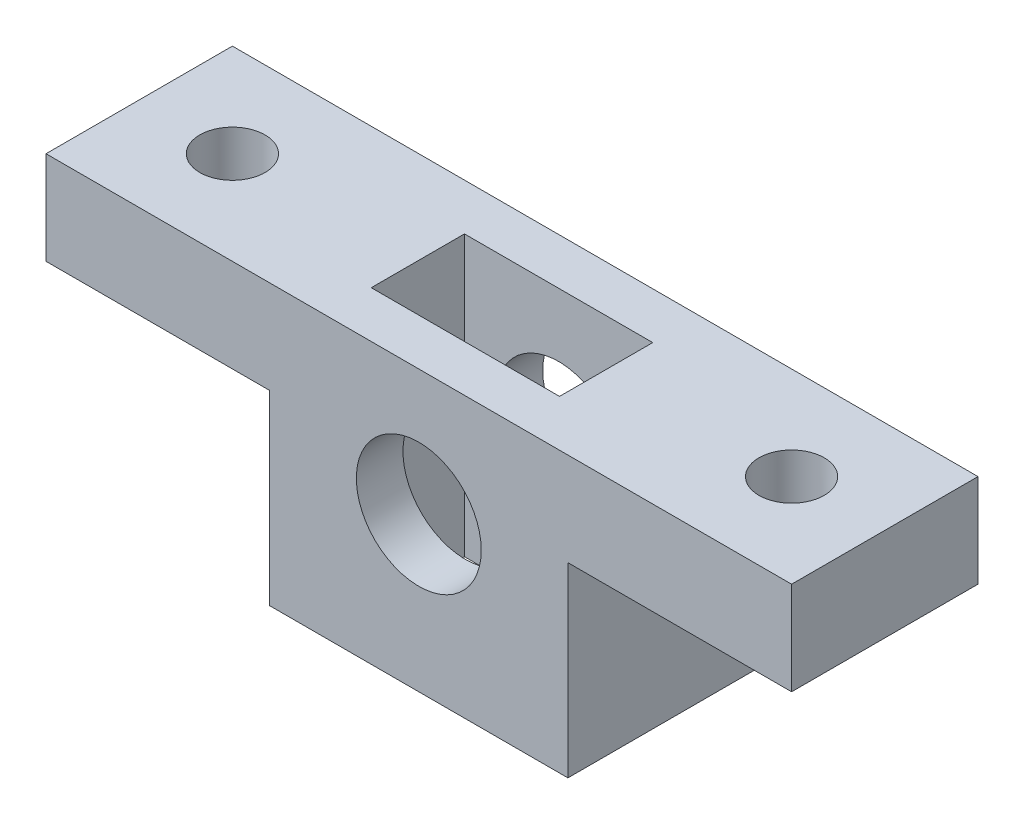
ISO-10303-21;
HEADER;
FILE_DESCRIPTION(('STEP AP214'),'2;1');
FILE_NAME('part.step','',(''),(''),'','','');
FILE_SCHEMA(('AUTOMOTIVE_DESIGN { 1 0 10303 214 1 1 1 1 }'));
ENDSEC;
DATA;
#1=APPLICATION_CONTEXT('core data for automotive mechanical design processes');
#2=APPLICATION_PROTOCOL_DEFINITION('international standard','automotive_design',2000,#1);
#3=PRODUCT_CONTEXT('',#1,'mechanical');
#4=PRODUCT('Part','Part','',(#3));
#5=PRODUCT_RELATED_PRODUCT_CATEGORY('part','',(#4));
#6=PRODUCT_DEFINITION_FORMATION('','',#4);
#7=PRODUCT_DEFINITION_CONTEXT('part definition',#1,'design');
#8=PRODUCT_DEFINITION('design','',#6,#7);
#9=PRODUCT_DEFINITION_SHAPE('','',#8);
#10=(LENGTH_UNIT() NAMED_UNIT(*) SI_UNIT(.MILLI.,.METRE.));
#11=(NAMED_UNIT(*) PLANE_ANGLE_UNIT() SI_UNIT($,.RADIAN.));
#12=(NAMED_UNIT(*) SI_UNIT($,.STERADIAN.) SOLID_ANGLE_UNIT());
#13=UNCERTAINTY_MEASURE_WITH_UNIT(LENGTH_MEASURE(1.E-05),#10,'distance_accuracy_value','');
#14=(GEOMETRIC_REPRESENTATION_CONTEXT(3) GLOBAL_UNCERTAINTY_ASSIGNED_CONTEXT((#13)) GLOBAL_UNIT_ASSIGNED_CONTEXT((#10,
#11,#12)) REPRESENTATION_CONTEXT('',''));
#15=CARTESIAN_POINT('',(0.,0.,0.));
#16=DIRECTION('',(0.,0.,1.));
#17=DIRECTION('',(1.,0.,0.));
#18=AXIS2_PLACEMENT_3D('',#15,#16,#17);
#19=CARTESIAN_POINT('',(0.,-6.74999999999999,10.));
#20=DIRECTION('',(0.,0.,-1.));
#21=DIRECTION('',(-1.,0.,0.));
#22=AXIS2_PLACEMENT_3D('',#19,#20,#21);
#23=CYLINDRICAL_SURFACE('',#22,3.35);
#24=CARTESIAN_POINT('',(0.,-6.74999999999999,2.5));
#25=DIRECTION('',(0.,0.,-1.));
#26=DIRECTION('',(-1.,0.,0.));
#27=AXIS2_PLACEMENT_3D('',#24,#25,#26);
#28=CIRCLE('',#27,3.35);
#29=CARTESIAN_POINT('',(-3.35,-6.74999999999999,2.5));
#30=VERTEX_POINT('',#29);
#31=EDGE_CURVE('E36',#30,#30,#28,.T.);
#32=ORIENTED_EDGE('',*,*,#31,.F.);
#33=EDGE_LOOP('',(#32));
#34=FACE_BOUND('',#33,.T.);
#35=CARTESIAN_POINT('',(0.,-6.74999999999999,0.));
#36=DIRECTION('',(0.,0.,1.));
#37=DIRECTION('',(1.,0.,0.));
#38=AXIS2_PLACEMENT_3D('',#35,#36,#37);
#39=CIRCLE('',#38,3.35);
#40=CARTESIAN_POINT('',(3.35,-6.74999999999999,0.));
#41=VERTEX_POINT('',#40);
#42=EDGE_CURVE('E175',#41,#41,#39,.T.);
#43=ORIENTED_EDGE('',*,*,#42,.F.);
#44=EDGE_LOOP('',(#43));
#45=FACE_BOUND('',#44,.T.);
#46=ADVANCED_FACE('F32',(#34,#45),#23,.F.);
#47=CARTESIAN_POINT('',(0.,0.,10.));
#48=DIRECTION('',(0.,0.,1.));
#49=DIRECTION('',(1.,0.,0.));
#50=AXIS2_PLACEMENT_3D('',#47,#48,#49);
#51=PLANE('',#50);
#52=DIRECTION('',(0.,1.,0.));
#53=VECTOR('',#52,1.);
#54=CARTESIAN_POINT('',(8.,-5.,10.));
#55=LINE('',#54,#53);
#56=CARTESIAN_POINT('',(8.,-15.,10.));
#57=VERTEX_POINT('',#56);
#58=CARTESIAN_POINT('',(8.,-5.,10.));
#59=VERTEX_POINT('',#58);
#60=EDGE_CURVE('E178',#57,#59,#55,.T.);
#61=ORIENTED_EDGE('',*,*,#60,.T.);
#62=DIRECTION('',(1.,0.,0.));
#63=VECTOR('',#62,1.);
#64=CARTESIAN_POINT('',(20.,-4.99999999999999,10.));
#65=LINE('',#64,#63);
#66=CARTESIAN_POINT('',(20.,-4.99999999999999,10.));
#67=VERTEX_POINT('',#66);
#68=EDGE_CURVE('E181',#59,#67,#65,.T.);
#69=ORIENTED_EDGE('',*,*,#68,.T.);
#70=DIRECTION('',(0.,1.,0.));
#71=VECTOR('',#70,1.);
#72=CARTESIAN_POINT('',(20.,0.,10.));
#73=LINE('',#72,#71);
#74=CARTESIAN_POINT('',(20.,0.,10.));
#75=VERTEX_POINT('',#74);
#76=EDGE_CURVE('E184',#67,#75,#73,.T.);
#77=ORIENTED_EDGE('',*,*,#76,.T.);
#78=DIRECTION('',(-1.,0.,0.));
#79=VECTOR('',#78,1.);
#80=CARTESIAN_POINT('',(-20.,0.,10.));
#81=LINE('',#80,#79);
#82=CARTESIAN_POINT('',(-20.,0.,10.));
#83=VERTEX_POINT('',#82);
#84=EDGE_CURVE('E186',#75,#83,#81,.T.);
#85=ORIENTED_EDGE('',*,*,#84,.T.);
#86=DIRECTION('',(0.,-1.,0.));
#87=VECTOR('',#86,1.);
#88=CARTESIAN_POINT('',(-20.,0.,10.));
#89=LINE('',#88,#87);
#90=CARTESIAN_POINT('',(-20.,-5.,10.));
#91=VERTEX_POINT('',#90);
#92=EDGE_CURVE('E188',#83,#91,#89,.T.);
#93=ORIENTED_EDGE('',*,*,#92,.T.);
#94=DIRECTION('',(1.,0.,0.));
#95=VECTOR('',#94,1.);
#96=CARTESIAN_POINT('',(-20.,-5.,10.));
#97=LINE('',#96,#95);
#98=CARTESIAN_POINT('',(-8.,-5.,10.));
#99=VERTEX_POINT('',#98);
#100=EDGE_CURVE('E190',#91,#99,#97,.T.);
#101=ORIENTED_EDGE('',*,*,#100,.T.);
#102=DIRECTION('',(0.,-1.,0.));
#103=VECTOR('',#102,1.);
#104=CARTESIAN_POINT('',(-8.,-5.,10.));
#105=LINE('',#104,#103);
#106=CARTESIAN_POINT('',(-8.,-15.,10.));
#107=VERTEX_POINT('',#106);
#108=EDGE_CURVE('E192',#99,#107,#105,.T.);
#109=ORIENTED_EDGE('',*,*,#108,.T.);
#110=DIRECTION('',(1.,0.,0.));
#111=VECTOR('',#110,1.);
#112=CARTESIAN_POINT('',(-8.,-15.,10.));
#113=LINE('',#112,#111);
#114=EDGE_CURVE('E194',#107,#57,#113,.T.);
#115=ORIENTED_EDGE('',*,*,#114,.T.);
#116=EDGE_LOOP('',(#61,#69,#77,#85,#93,#101,#109,#115));
#117=FACE_BOUND('',#116,.T.);
#118=CARTESIAN_POINT('',(0.,-6.74999999999999,10.));
#119=DIRECTION('',(0.,0.,1.));
#120=DIRECTION('',(1.,0.,0.));
#121=AXIS2_PLACEMENT_3D('',#118,#119,#120);
#122=CIRCLE('',#121,3.35);
#123=CARTESIAN_POINT('',(3.35,-6.74999999999999,10.));
#124=VERTEX_POINT('',#123);
#125=EDGE_CURVE('E171',#124,#124,#122,.T.);
#126=ORIENTED_EDGE('',*,*,#125,.F.);
#127=EDGE_LOOP('',(#126));
#128=FACE_BOUND('',#127,.T.);
#129=ADVANCED_FACE('F243',(#117,#128),#51,.T.);
#130=CARTESIAN_POINT('',(0.,0.,0.));
#131=DIRECTION('',(0.,0.,1.));
#132=DIRECTION('',(1.,0.,0.));
#133=AXIS2_PLACEMENT_3D('',#130,#131,#132);
#134=PLANE('',#133);
#135=DIRECTION('',(0.,1.,0.));
#136=VECTOR('',#135,1.);
#137=CARTESIAN_POINT('',(8.,-5.,0.));
#138=LINE('',#137,#136);
#139=CARTESIAN_POINT('',(8.,-15.,0.));
#140=VERTEX_POINT('',#139);
#141=CARTESIAN_POINT('',(8.,-5.,0.));
#142=VERTEX_POINT('',#141);
#143=EDGE_CURVE('E174',#140,#142,#138,.T.);
#144=ORIENTED_EDGE('',*,*,#143,.F.);
#145=DIRECTION('',(1.,0.,0.));
#146=VECTOR('',#145,1.);
#147=CARTESIAN_POINT('',(-8.,-15.,0.));
#148=LINE('',#147,#146);
#149=CARTESIAN_POINT('',(-8.,-15.,0.));
#150=VERTEX_POINT('',#149);
#151=EDGE_CURVE('E182',#150,#140,#148,.T.);
#152=ORIENTED_EDGE('',*,*,#151,.F.);
#153=DIRECTION('',(0.,-1.,0.));
#154=VECTOR('',#153,1.);
#155=CARTESIAN_POINT('',(-8.,-5.,0.));
#156=LINE('',#155,#154);
#157=CARTESIAN_POINT('',(-8.,-5.,0.));
#158=VERTEX_POINT('',#157);
#159=EDGE_CURVE('E209',#158,#150,#156,.T.);
#160=ORIENTED_EDGE('',*,*,#159,.F.);
#161=DIRECTION('',(1.,0.,0.));
#162=VECTOR('',#161,1.);
#163=CARTESIAN_POINT('',(-20.,-5.,0.));
#164=LINE('',#163,#162);
#165=CARTESIAN_POINT('',(-20.,-5.,0.));
#166=VERTEX_POINT('',#165);
#167=EDGE_CURVE('E207',#166,#158,#164,.T.);
#168=ORIENTED_EDGE('',*,*,#167,.F.);
#169=DIRECTION('',(0.,-1.,0.));
#170=VECTOR('',#169,1.);
#171=CARTESIAN_POINT('',(-20.,0.,0.));
#172=LINE('',#171,#170);
#173=CARTESIAN_POINT('',(-20.,0.,0.));
#174=VERTEX_POINT('',#173);
#175=EDGE_CURVE('E205',#174,#166,#172,.T.);
#176=ORIENTED_EDGE('',*,*,#175,.F.);
#177=DIRECTION('',(-1.,0.,0.));
#178=VECTOR('',#177,1.);
#179=CARTESIAN_POINT('',(-20.,0.,0.));
#180=LINE('',#179,#178);
#181=CARTESIAN_POINT('',(20.,0.,0.));
#182=VERTEX_POINT('',#181);
#183=EDGE_CURVE('E203',#182,#174,#180,.T.);
#184=ORIENTED_EDGE('',*,*,#183,.F.);
#185=DIRECTION('',(0.,1.,0.));
#186=VECTOR('',#185,1.);
#187=CARTESIAN_POINT('',(20.,0.,0.));
#188=LINE('',#187,#186);
#189=CARTESIAN_POINT('',(20.,-4.99999999999999,0.));
#190=VERTEX_POINT('',#189);
#191=EDGE_CURVE('E201',#190,#182,#188,.T.);
#192=ORIENTED_EDGE('',*,*,#191,.F.);
#193=DIRECTION('',(1.,0.,0.));
#194=VECTOR('',#193,1.);
#195=CARTESIAN_POINT('',(20.,-4.99999999999999,0.));
#196=LINE('',#195,#194);
#197=EDGE_CURVE('E199',#142,#190,#196,.T.);
#198=ORIENTED_EDGE('',*,*,#197,.F.);
#199=EDGE_LOOP('',(#144,#152,#160,#168,#176,#184,#192,#198));
#200=FACE_BOUND('',#199,.T.);
#201=ORIENTED_EDGE('',*,*,#42,.T.);
#202=EDGE_LOOP('',(#201));
#203=FACE_BOUND('',#202,.T.);
#204=ADVANCED_FACE('F245',(#200,#203),#134,.F.);
#205=CARTESIAN_POINT('',(8.,-5.,10.));
#206=DIRECTION('',(-1.,0.,0.));
#207=DIRECTION('',(0.,-1.,0.));
#208=AXIS2_PLACEMENT_3D('',#205,#206,#207);
#209=PLANE('',#208);
#210=ORIENTED_EDGE('',*,*,#143,.T.);
#211=DIRECTION('',(0.,0.,-1.));
#212=VECTOR('',#211,1.);
#213=CARTESIAN_POINT('',(8.,-5.,10.));
#214=LINE('',#213,#212);
#215=EDGE_CURVE('E11',#59,#142,#214,.T.);
#216=ORIENTED_EDGE('',*,*,#215,.F.);
#217=ORIENTED_EDGE('',*,*,#60,.F.);
#218=DIRECTION('',(0.,0.,-1.));
#219=VECTOR('',#218,1.);
#220=CARTESIAN_POINT('',(8.,-15.,10.));
#221=LINE('',#220,#219);
#222=EDGE_CURVE('E196',#57,#140,#221,.T.);
#223=ORIENTED_EDGE('',*,*,#222,.T.);
#224=EDGE_LOOP('',(#210,#216,#217,#223));
#225=FACE_BOUND('',#224,.T.);
#226=ADVANCED_FACE('F34',(#225),#209,.F.);
#227=CARTESIAN_POINT('',(20.,-4.99999999999999,10.));
#228=DIRECTION('',(0.,1.,0.));
#229=DIRECTION('',(-1.,0.,0.));
#230=AXIS2_PLACEMENT_3D('',#227,#228,#229);
#231=PLANE('',#230);
#232=CARTESIAN_POINT('',(15.,-5.,5.));
#233=DIRECTION('',(0.,1.,0.));
#234=DIRECTION('',(-1.,0.,0.));
#235=AXIS2_PLACEMENT_3D('',#232,#233,#234);
#236=CIRCLE('',#235,1.75);
#237=CARTESIAN_POINT('',(13.25,-5.,5.));
#238=VERTEX_POINT('',#237);
#239=EDGE_CURVE('E164',#238,#238,#236,.T.);
#240=ORIENTED_EDGE('',*,*,#239,.T.);
#241=EDGE_LOOP('',(#240));
#242=FACE_BOUND('',#241,.T.);
#243=ORIENTED_EDGE('',*,*,#197,.T.);
#244=DIRECTION('',(0.,0.,-1.));
#245=VECTOR('',#244,1.);
#246=CARTESIAN_POINT('',(20.,-4.99999999999999,10.));
#247=LINE('',#246,#245);
#248=EDGE_CURVE('E41',#67,#190,#247,.T.);
#249=ORIENTED_EDGE('',*,*,#248,.F.);
#250=ORIENTED_EDGE('',*,*,#68,.F.);
#251=ORIENTED_EDGE('',*,*,#215,.T.);
#252=EDGE_LOOP('',(#243,#249,#250,#251));
#253=FACE_BOUND('',#252,.T.);
#254=ADVANCED_FACE('F277',(#242,#253),#231,.F.);
#255=CARTESIAN_POINT('',(20.,0.,10.));
#256=DIRECTION('',(-1.,0.,0.));
#257=DIRECTION('',(0.,0.,1.));
#258=AXIS2_PLACEMENT_3D('',#255,#256,#257);
#259=PLANE('',#258);
#260=ORIENTED_EDGE('',*,*,#191,.T.);
#261=DIRECTION('',(0.,0.,-1.));
#262=VECTOR('',#261,1.);
#263=CARTESIAN_POINT('',(20.,0.,10.));
#264=LINE('',#263,#262);
#265=EDGE_CURVE('E226',#75,#182,#264,.T.);
#266=ORIENTED_EDGE('',*,*,#265,.F.);
#267=ORIENTED_EDGE('',*,*,#76,.F.);
#268=ORIENTED_EDGE('',*,*,#248,.T.);
#269=EDGE_LOOP('',(#260,#266,#267,#268));
#270=FACE_BOUND('',#269,.T.);
#271=ADVANCED_FACE('F274',(#270),#259,.F.);
#272=CARTESIAN_POINT('',(-20.,0.,10.));
#273=DIRECTION('',(0.,-1.,0.));
#274=DIRECTION('',(1.,0.,0.));
#275=AXIS2_PLACEMENT_3D('',#272,#273,#274);
#276=PLANE('',#275);
#277=DIRECTION('',(1.,0.,0.));
#278=VECTOR('',#277,1.);
#279=CARTESIAN_POINT('',(-20.,0.,2.5));
#280=LINE('',#279,#278);
#281=CARTESIAN_POINT('',(-5.05,0.,2.5));
#282=VERTEX_POINT('',#281);
#283=CARTESIAN_POINT('',(5.05,0.,2.5));
#284=VERTEX_POINT('',#283);
#285=EDGE_CURVE('E154',#282,#284,#280,.T.);
#286=ORIENTED_EDGE('',*,*,#285,.T.);
#287=DIRECTION('',(0.,0.,1.));
#288=VECTOR('',#287,1.);
#289=CARTESIAN_POINT('',(5.05,0.,10.));
#290=LINE('',#289,#288);
#291=CARTESIAN_POINT('',(5.05,0.,7.5));
#292=VERTEX_POINT('',#291);
#293=EDGE_CURVE('E158',#284,#292,#290,.T.);
#294=ORIENTED_EDGE('',*,*,#293,.T.);
#295=DIRECTION('',(-1.,0.,0.));
#296=VECTOR('',#295,1.);
#297=CARTESIAN_POINT('',(-20.,0.,7.5));
#298=LINE('',#297,#296);
#299=CARTESIAN_POINT('',(-5.05,0.,7.5));
#300=VERTEX_POINT('',#299);
#301=EDGE_CURVE('E152',#292,#300,#298,.T.);
#302=ORIENTED_EDGE('',*,*,#301,.T.);
#303=DIRECTION('',(0.,0.,-1.));
#304=VECTOR('',#303,1.);
#305=CARTESIAN_POINT('',(-5.05,0.,10.));
#306=LINE('',#305,#304);
#307=EDGE_CURVE('E129',#300,#282,#306,.T.);
#308=ORIENTED_EDGE('',*,*,#307,.T.);
#309=EDGE_LOOP('',(#286,#294,#302,#308));
#310=FACE_BOUND('',#309,.T.);
#311=CARTESIAN_POINT('',(15.,0.,5.));
#312=DIRECTION('',(0.,1.,0.));
#313=DIRECTION('',(1.,0.,0.));
#314=AXIS2_PLACEMENT_3D('',#311,#312,#313);
#315=CIRCLE('',#314,1.75);
#316=CARTESIAN_POINT('',(16.75,0.,5.));
#317=VERTEX_POINT('',#316);
#318=EDGE_CURVE('E161',#317,#317,#315,.T.);
#319=ORIENTED_EDGE('',*,*,#318,.F.);
#320=EDGE_LOOP('',(#319));
#321=FACE_BOUND('',#320,.T.);
#322=CARTESIAN_POINT('',(-15.,0.,5.));
#323=DIRECTION('',(0.,1.,0.));
#324=DIRECTION('',(-1.,0.,0.));
#325=AXIS2_PLACEMENT_3D('',#322,#323,#324);
#326=CIRCLE('',#325,1.75);
#327=CARTESIAN_POINT('',(-16.75,0.,5.));
#328=VERTEX_POINT('',#327);
#329=EDGE_CURVE('E167',#328,#328,#326,.T.);
#330=ORIENTED_EDGE('',*,*,#329,.F.);
#331=EDGE_LOOP('',(#330));
#332=FACE_BOUND('',#331,.T.);
#333=ORIENTED_EDGE('',*,*,#183,.T.);
#334=DIRECTION('',(0.,0.,-1.));
#335=VECTOR('',#334,1.);
#336=CARTESIAN_POINT('',(-20.,0.,10.));
#337=LINE('',#336,#335);
#338=EDGE_CURVE('E223',#83,#174,#337,.T.);
#339=ORIENTED_EDGE('',*,*,#338,.F.);
#340=ORIENTED_EDGE('',*,*,#84,.F.);
#341=ORIENTED_EDGE('',*,*,#265,.T.);
#342=EDGE_LOOP('',(#333,#339,#340,#341));
#343=FACE_BOUND('',#342,.T.);
#344=ADVANCED_FACE('F270',(#310,#321,#332,#343),#276,.F.);
#345=CARTESIAN_POINT('',(-20.,0.,10.));
#346=DIRECTION('',(1.,0.,0.));
#347=DIRECTION('',(0.,0.,-1.));
#348=AXIS2_PLACEMENT_3D('',#345,#346,#347);
#349=PLANE('',#348);
#350=ORIENTED_EDGE('',*,*,#175,.T.);
#351=DIRECTION('',(0.,0.,-1.));
#352=VECTOR('',#351,1.);
#353=CARTESIAN_POINT('',(-20.,-5.,10.));
#354=LINE('',#353,#352);
#355=EDGE_CURVE('E220',#91,#166,#354,.T.);
#356=ORIENTED_EDGE('',*,*,#355,.F.);
#357=ORIENTED_EDGE('',*,*,#92,.F.);
#358=ORIENTED_EDGE('',*,*,#338,.T.);
#359=EDGE_LOOP('',(#350,#356,#357,#358));
#360=FACE_BOUND('',#359,.T.);
#361=ADVANCED_FACE('F266',(#360),#349,.F.);
#362=CARTESIAN_POINT('',(-20.,-5.,10.));
#363=DIRECTION('',(0.,1.,0.));
#364=DIRECTION('',(0.,0.,1.));
#365=AXIS2_PLACEMENT_3D('',#362,#363,#364);
#366=PLANE('',#365);
#367=CARTESIAN_POINT('',(-15.,-5.,5.));
#368=DIRECTION('',(0.,1.,0.));
#369=DIRECTION('',(0.,0.,1.));
#370=AXIS2_PLACEMENT_3D('',#367,#368,#369);
#371=CIRCLE('',#370,1.75);
#372=CARTESIAN_POINT('',(-15.,-5.,6.75));
#373=VERTEX_POINT('',#372);
#374=EDGE_CURVE('E170',#373,#373,#371,.T.);
#375=ORIENTED_EDGE('',*,*,#374,.T.);
#376=EDGE_LOOP('',(#375));
#377=FACE_BOUND('',#376,.T.);
#378=ORIENTED_EDGE('',*,*,#167,.T.);
#379=DIRECTION('',(0.,0.,-1.));
#380=VECTOR('',#379,1.);
#381=CARTESIAN_POINT('',(-8.,-5.,10.));
#382=LINE('',#381,#380);
#383=EDGE_CURVE('E217',#99,#158,#382,.T.);
#384=ORIENTED_EDGE('',*,*,#383,.F.);
#385=ORIENTED_EDGE('',*,*,#100,.F.);
#386=ORIENTED_EDGE('',*,*,#355,.T.);
#387=EDGE_LOOP('',(#378,#384,#385,#386));
#388=FACE_BOUND('',#387,.T.);
#389=ADVANCED_FACE('F262',(#377,#388),#366,.F.);
#390=CARTESIAN_POINT('',(-8.,-5.,10.));
#391=DIRECTION('',(1.,0.,0.));
#392=DIRECTION('',(0.,1.,0.));
#393=AXIS2_PLACEMENT_3D('',#390,#391,#392);
#394=PLANE('',#393);
#395=ORIENTED_EDGE('',*,*,#159,.T.);
#396=DIRECTION('',(0.,0.,-1.));
#397=VECTOR('',#396,1.);
#398=CARTESIAN_POINT('',(-8.,-15.,10.));
#399=LINE('',#398,#397);
#400=EDGE_CURVE('E214',#107,#150,#399,.T.);
#401=ORIENTED_EDGE('',*,*,#400,.F.);
#402=ORIENTED_EDGE('',*,*,#108,.F.);
#403=ORIENTED_EDGE('',*,*,#383,.T.);
#404=EDGE_LOOP('',(#395,#401,#402,#403));
#405=FACE_BOUND('',#404,.T.);
#406=ADVANCED_FACE('F259',(#405),#394,.F.);
#407=CARTESIAN_POINT('',(-8.,-15.,10.));
#408=DIRECTION('',(0.,1.,0.));
#409=DIRECTION('',(-1.,0.,0.));
#410=AXIS2_PLACEMENT_3D('',#407,#408,#409);
#411=PLANE('',#410);
#412=DIRECTION('',(-1.,0.,0.));
#413=VECTOR('',#412,1.);
#414=CARTESIAN_POINT('',(-5.05,-15.,7.5));
#415=LINE('',#414,#413);
#416=CARTESIAN_POINT('',(5.05,-15.,7.5));
#417=VERTEX_POINT('',#416);
#418=CARTESIAN_POINT('',(-5.05,-15.,7.5));
#419=VERTEX_POINT('',#418);
#420=EDGE_CURVE('E135',#417,#419,#415,.T.);
#421=ORIENTED_EDGE('',*,*,#420,.F.);
#422=DIRECTION('',(0.,0.,1.));
#423=VECTOR('',#422,1.);
#424=CARTESIAN_POINT('',(5.05,-15.,7.5));
#425=LINE('',#424,#423);
#426=CARTESIAN_POINT('',(5.05,-15.,2.5));
#427=VERTEX_POINT('',#426);
#428=EDGE_CURVE('E57',#427,#417,#425,.T.);
#429=ORIENTED_EDGE('',*,*,#428,.F.);
#430=DIRECTION('',(1.,0.,0.));
#431=VECTOR('',#430,1.);
#432=CARTESIAN_POINT('',(-5.05,-15.,2.5));
#433=LINE('',#432,#431);
#434=CARTESIAN_POINT('',(-5.05,-15.,2.5));
#435=VERTEX_POINT('',#434);
#436=EDGE_CURVE('E142',#435,#427,#433,.T.);
#437=ORIENTED_EDGE('',*,*,#436,.F.);
#438=DIRECTION('',(0.,0.,-1.));
#439=VECTOR('',#438,1.);
#440=CARTESIAN_POINT('',(-5.05,-15.,7.5));
#441=LINE('',#440,#439);
#442=EDGE_CURVE('E126',#419,#435,#441,.T.);
#443=ORIENTED_EDGE('',*,*,#442,.F.);
#444=EDGE_LOOP('',(#421,#429,#437,#443));
#445=FACE_BOUND('',#444,.T.);
#446=ORIENTED_EDGE('',*,*,#151,.T.);
#447=ORIENTED_EDGE('',*,*,#222,.F.);
#448=ORIENTED_EDGE('',*,*,#114,.F.);
#449=ORIENTED_EDGE('',*,*,#400,.T.);
#450=EDGE_LOOP('',(#446,#447,#448,#449));
#451=FACE_BOUND('',#450,.T.);
#452=ADVANCED_FACE('F139',(#445,#451),#411,.F.);
#453=CARTESIAN_POINT('',(0.,-6.74999999999999,7.5));
#454=DIRECTION('',(0.,0.,1.));
#455=DIRECTION('',(1.,0.,0.));
#456=AXIS2_PLACEMENT_3D('',#453,#454,#455);
#457=CIRCLE('',#456,3.35);
#458=CARTESIAN_POINT('',(3.35,-6.74999999999999,7.5));
#459=VERTEX_POINT('',#458);
#460=EDGE_CURVE('E149',#459,#459,#457,.T.);
#461=ORIENTED_EDGE('',*,*,#460,.F.);
#462=EDGE_LOOP('',(#461));
#463=FACE_BOUND('',#462,.T.);
#464=ORIENTED_EDGE('',*,*,#125,.T.);
#465=EDGE_LOOP('',(#464));
#466=FACE_BOUND('',#465,.T.);
#467=ADVANCED_FACE('F236',(#463,#466),#23,.F.);
#468=CARTESIAN_POINT('',(-15.,-10.,5.));
#469=DIRECTION('',(0.,1.,0.));
#470=DIRECTION('',(-1.,0.,0.));
#471=AXIS2_PLACEMENT_3D('',#468,#469,#470);
#472=CYLINDRICAL_SURFACE('',#471,1.75);
#473=ORIENTED_EDGE('',*,*,#329,.T.);
#474=EDGE_LOOP('',(#473));
#475=FACE_BOUND('',#474,.T.);
#476=ORIENTED_EDGE('',*,*,#374,.F.);
#477=EDGE_LOOP('',(#476));
#478=FACE_BOUND('',#477,.T.);
#479=ADVANCED_FACE('F239',(#475,#478),#472,.F.);
#480=CARTESIAN_POINT('',(15.,-10.,5.));
#481=DIRECTION('',(0.,1.,0.));
#482=DIRECTION('',(-1.,0.,0.));
#483=AXIS2_PLACEMENT_3D('',#480,#481,#482);
#484=CYLINDRICAL_SURFACE('',#483,1.75);
#485=ORIENTED_EDGE('',*,*,#318,.T.);
#486=EDGE_LOOP('',(#485));
#487=FACE_BOUND('',#486,.T.);
#488=ORIENTED_EDGE('',*,*,#239,.F.);
#489=EDGE_LOOP('',(#488));
#490=FACE_BOUND('',#489,.T.);
#491=ADVANCED_FACE('F315',(#487,#490),#484,.F.);
#492=CARTESIAN_POINT('',(5.05,5.,7.5));
#493=DIRECTION('',(1.,0.,0.));
#494=DIRECTION('',(0.,0.,-1.));
#495=AXIS2_PLACEMENT_3D('',#492,#493,#494);
#496=PLANE('',#495);
#497=DIRECTION('',(0.,-1.,0.));
#498=VECTOR('',#497,1.);
#499=CARTESIAN_POINT('',(5.05,5.,2.5));
#500=LINE('',#499,#498);
#501=EDGE_CURVE('E147',#284,#427,#500,.T.);
#502=ORIENTED_EDGE('',*,*,#501,.T.);
#503=ORIENTED_EDGE('',*,*,#428,.T.);
#504=DIRECTION('',(0.,-1.,0.));
#505=VECTOR('',#504,1.);
#506=CARTESIAN_POINT('',(5.05,5.,7.5));
#507=LINE('',#506,#505);
#508=EDGE_CURVE('E132',#292,#417,#507,.T.);
#509=ORIENTED_EDGE('',*,*,#508,.F.);
#510=ORIENTED_EDGE('',*,*,#293,.F.);
#511=EDGE_LOOP('',(#502,#503,#509,#510));
#512=FACE_BOUND('',#511,.T.);
#513=ADVANCED_FACE('F317',(#512),#496,.F.);
#514=CARTESIAN_POINT('',(-5.05,5.,7.5));
#515=DIRECTION('',(-1.,0.,0.));
#516=DIRECTION('',(0.,-1.,0.));
#517=AXIS2_PLACEMENT_3D('',#514,#515,#516);
#518=PLANE('',#517);
#519=DIRECTION('',(0.,-1.,0.));
#520=VECTOR('',#519,1.);
#521=CARTESIAN_POINT('',(-5.05,5.,7.5));
#522=LINE('',#521,#520);
#523=EDGE_CURVE('E49',#300,#419,#522,.T.);
#524=ORIENTED_EDGE('',*,*,#523,.T.);
#525=ORIENTED_EDGE('',*,*,#442,.T.);
#526=DIRECTION('',(0.,-1.,0.));
#527=VECTOR('',#526,1.);
#528=CARTESIAN_POINT('',(-5.05,5.,2.5));
#529=LINE('',#528,#527);
#530=EDGE_CURVE('E131',#282,#435,#529,.T.);
#531=ORIENTED_EDGE('',*,*,#530,.F.);
#532=ORIENTED_EDGE('',*,*,#307,.F.);
#533=EDGE_LOOP('',(#524,#525,#531,#532));
#534=FACE_BOUND('',#533,.T.);
#535=ADVANCED_FACE('F123',(#534),#518,.F.);
#536=CARTESIAN_POINT('',(-5.05,5.,2.5));
#537=DIRECTION('',(0.,0.,-1.));
#538=DIRECTION('',(-1.,0.,0.));
#539=AXIS2_PLACEMENT_3D('',#536,#537,#538);
#540=PLANE('',#539);
#541=ORIENTED_EDGE('',*,*,#31,.T.);
#542=EDGE_LOOP('',(#541));
#543=FACE_BOUND('',#542,.T.);
#544=ORIENTED_EDGE('',*,*,#530,.T.);
#545=ORIENTED_EDGE('',*,*,#436,.T.);
#546=ORIENTED_EDGE('',*,*,#501,.F.);
#547=ORIENTED_EDGE('',*,*,#285,.F.);
#548=EDGE_LOOP('',(#544,#545,#546,#547));
#549=FACE_BOUND('',#548,.T.);
#550=ADVANCED_FACE('F329',(#543,#549),#540,.F.);
#551=CARTESIAN_POINT('',(-5.05,5.,7.5));
#552=DIRECTION('',(0.,0.,1.));
#553=DIRECTION('',(1.,0.,0.));
#554=AXIS2_PLACEMENT_3D('',#551,#552,#553);
#555=PLANE('',#554);
#556=ORIENTED_EDGE('',*,*,#460,.T.);
#557=EDGE_LOOP('',(#556));
#558=FACE_BOUND('',#557,.T.);
#559=ORIENTED_EDGE('',*,*,#508,.T.);
#560=ORIENTED_EDGE('',*,*,#420,.T.);
#561=ORIENTED_EDGE('',*,*,#523,.F.);
#562=ORIENTED_EDGE('',*,*,#301,.F.);
#563=EDGE_LOOP('',(#559,#560,#561,#562));
#564=FACE_BOUND('',#563,.T.);
#565=ADVANCED_FACE('F136',(#558,#564),#555,.F.);
#566=CLOSED_SHELL('',(#46,#129,#204,#226,#254,#271,#344,#361,#389,#406,#452,#467,#479,#491,#513,
#535,#550,#565));
#567=MANIFOLD_SOLID_BREP('B2',#566);
#568=ADVANCED_BREP_SHAPE_REPRESENTATION('',(#18,#567),#14);
#569=SHAPE_DEFINITION_REPRESENTATION(#9,#568);
ENDSEC;
END-ISO-10303-21;
